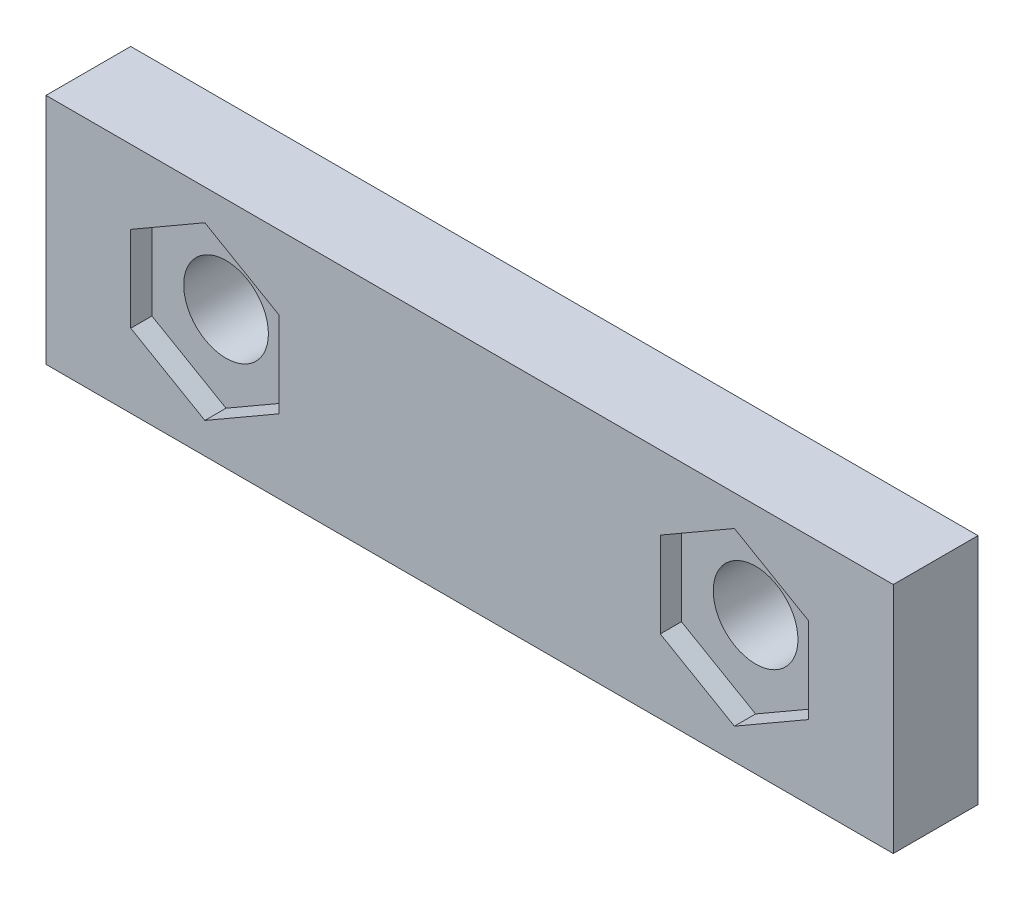
ISO-10303-21;
HEADER;
FILE_DESCRIPTION(('STEP AP214'),'2;1');
FILE_NAME('part.step','',(''),(''),'','','');
FILE_SCHEMA(('AUTOMOTIVE_DESIGN { 1 0 10303 214 1 1 1 1 }'));
ENDSEC;
DATA;
#1=APPLICATION_CONTEXT('core data for automotive mechanical design processes');
#2=APPLICATION_PROTOCOL_DEFINITION('international standard','automotive_design',2000,#1);
#3=PRODUCT_CONTEXT('',#1,'mechanical');
#4=PRODUCT('Part','Part','',(#3));
#5=PRODUCT_RELATED_PRODUCT_CATEGORY('part','',(#4));
#6=PRODUCT_DEFINITION_FORMATION('','',#4);
#7=PRODUCT_DEFINITION_CONTEXT('part definition',#1,'design');
#8=PRODUCT_DEFINITION('design','',#6,#7);
#9=PRODUCT_DEFINITION_SHAPE('','',#8);
#10=(LENGTH_UNIT() NAMED_UNIT(*) SI_UNIT(.MILLI.,.METRE.));
#11=(NAMED_UNIT(*) PLANE_ANGLE_UNIT() SI_UNIT($,.RADIAN.));
#12=(NAMED_UNIT(*) SI_UNIT($,.STERADIAN.) SOLID_ANGLE_UNIT());
#13=UNCERTAINTY_MEASURE_WITH_UNIT(LENGTH_MEASURE(1.E-05),#10,'distance_accuracy_value','');
#14=(GEOMETRIC_REPRESENTATION_CONTEXT(3) GLOBAL_UNCERTAINTY_ASSIGNED_CONTEXT((#13)) GLOBAL_UNIT_ASSIGNED_CONTEXT((#10,
#11,#12)) REPRESENTATION_CONTEXT('',''));
#15=CARTESIAN_POINT('',(0.,0.,0.));
#16=DIRECTION('',(0.,0.,1.));
#17=DIRECTION('',(1.,0.,0.));
#18=AXIS2_PLACEMENT_3D('',#15,#16,#17);
#19=CARTESIAN_POINT('',(0.,0.,3.));
#20=DIRECTION('',(0.,0.,1.));
#21=DIRECTION('',(1.,0.,0.));
#22=AXIS2_PLACEMENT_3D('',#19,#20,#21);
#23=PLANE('',#22);
#24=DIRECTION('',(-0.86602540378444,0.499999999999997,0.));
#25=VECTOR('',#24,1.);
#26=CARTESIAN_POINT('',(31.8394284148495,55.147507698472,3.));
#27=LINE('',#26,#25);
#28=CARTESIAN_POINT('',(212.3,-49.0414518843276,3.));
#29=VERTEX_POINT('',#28);
#30=CARTESIAN_POINT('',(208.8,-47.0207259421639,3.));
#31=VERTEX_POINT('',#30);
#32=EDGE_CURVE('E271',#29,#31,#27,.T.);
#33=ORIENTED_EDGE('',*,*,#32,.F.);
#34=DIRECTION('',(-0.866025403784433,-0.500000000000009,0.));
#35=VECTOR('',#34,1.);
#36=CARTESIAN_POINT('',(74.3105715851521,-128.709685524964,3.));
#37=LINE('',#36,#35);
#38=CARTESIAN_POINT('',(215.8,-47.0207259421639,3.));
#39=VERTEX_POINT('',#38);
#40=EDGE_CURVE('E248',#39,#29,#37,.T.);
#41=ORIENTED_EDGE('',*,*,#40,.F.);
#42=DIRECTION('',(0.,-1.,0.));
#43=VECTOR('',#42,1.);
#44=CARTESIAN_POINT('',(215.8,-1.48205481329132E-12,3.));
#45=LINE('',#44,#43);
#46=CARTESIAN_POINT('',(215.8,-42.9792740578364,3.));
#47=VERTEX_POINT('',#46);
#48=EDGE_CURVE('E263',#47,#39,#45,.T.);
#49=ORIENTED_EDGE('',*,*,#48,.F.);
#50=DIRECTION('',(0.86602540378444,-0.499999999999998,0.));
#51=VECTOR('',#50,1.);
#52=CARTESIAN_POINT('',(35.3394284148497,61.2096855249632,3.));
#53=LINE('',#52,#51);
#54=CARTESIAN_POINT('',(212.3,-40.9585481156727,3.));
#55=VERTEX_POINT('',#54);
#56=EDGE_CURVE('E266',#55,#47,#53,.T.);
#57=ORIENTED_EDGE('',*,*,#56,.F.);
#58=DIRECTION('',(0.866025403784439,0.5,0.));
#59=VECTOR('',#58,1.);
#60=CARTESIAN_POINT('',(70.8105715851499,-122.647507698473,3.));
#61=LINE('',#60,#59);
#62=CARTESIAN_POINT('',(208.8,-42.9792740578364,3.));
#63=VERTEX_POINT('',#62);
#64=EDGE_CURVE('E57',#63,#55,#61,.T.);
#65=ORIENTED_EDGE('',*,*,#64,.F.);
#66=DIRECTION('',(0.,1.,0.));
#67=VECTOR('',#66,1.);
#68=CARTESIAN_POINT('',(208.8,0.,3.));
#69=LINE('',#68,#67);
#70=EDGE_CURVE('E52',#31,#63,#69,.T.);
#71=ORIENTED_EDGE('',*,*,#70,.F.);
#72=EDGE_LOOP('',(#33,#41,#49,#57,#65,#71));
#73=FACE_BOUND('',#72,.T.);
#74=CARTESIAN_POINT('',(212.3,-45.0000000000001,3.));
#75=DIRECTION('',(0.,0.,1.));
#76=DIRECTION('',(1.,0.,0.));
#77=AXIS2_PLACEMENT_3D('',#74,#75,#76);
#78=CIRCLE('',#77,2.);
#79=CARTESIAN_POINT('',(214.3,-45.0000000000001,3.));
#80=VERTEX_POINT('',#79);
#81=EDGE_CURVE('E274',#80,#80,#78,.T.);
#82=ORIENTED_EDGE('',*,*,#81,.F.);
#83=EDGE_LOOP('',(#82));
#84=FACE_BOUND('',#83,.T.);
#85=ADVANCED_FACE('F37',(#73,#84),#23,.T.);
#86=CARTESIAN_POINT('',(0.,-39.5000000000002,3.));
#87=DIRECTION('',(0.,-1.,0.));
#88=DIRECTION('',(1.,0.,0.));
#89=AXIS2_PLACEMENT_3D('',#86,#87,#88);
#90=PLANE('',#89);
#91=DIRECTION('',(-1.,0.,0.));
#92=VECTOR('',#91,1.);
#93=CARTESIAN_POINT('',(0.,-39.5000000000002,0.));
#94=LINE('',#93,#92);
#95=CARTESIAN_POINT('',(219.8,-39.5000000000001,0.));
#96=VERTEX_POINT('',#95);
#97=CARTESIAN_POINT('',(179.8,-39.5000000000002,0.));
#98=VERTEX_POINT('',#97);
#99=EDGE_CURVE('E273',#96,#98,#94,.T.);
#100=ORIENTED_EDGE('',*,*,#99,.T.);
#101=DIRECTION('',(0.,0.,-1.));
#102=VECTOR('',#101,1.);
#103=CARTESIAN_POINT('',(179.8,-39.5000000000002,3.));
#104=LINE('',#103,#102);
#105=CARTESIAN_POINT('',(179.8,-39.5000000000002,4.));
#106=VERTEX_POINT('',#105);
#107=EDGE_CURVE('E11',#106,#98,#104,.T.);
#108=ORIENTED_EDGE('',*,*,#107,.F.);
#109=DIRECTION('',(-1.,0.,0.));
#110=VECTOR('',#109,1.);
#111=CARTESIAN_POINT('',(0.,-39.5000000000002,4.));
#112=LINE('',#111,#110);
#113=CARTESIAN_POINT('',(219.8,-39.5000000000001,4.));
#114=VERTEX_POINT('',#113);
#115=EDGE_CURVE('E204',#114,#106,#112,.T.);
#116=ORIENTED_EDGE('',*,*,#115,.F.);
#117=DIRECTION('',(0.,0.,-1.));
#118=VECTOR('',#117,1.);
#119=CARTESIAN_POINT('',(219.8,-39.5000000000001,3.));
#120=LINE('',#119,#118);
#121=EDGE_CURVE('E281',#114,#96,#120,.T.);
#122=ORIENTED_EDGE('',*,*,#121,.T.);
#123=EDGE_LOOP('',(#100,#108,#116,#122));
#124=FACE_BOUND('',#123,.T.);
#125=ADVANCED_FACE('F39',(#124),#90,.F.);
#126=CARTESIAN_POINT('',(179.8,0.,3.));
#127=DIRECTION('',(1.,0.,0.));
#128=DIRECTION('',(0.,0.,-1.));
#129=AXIS2_PLACEMENT_3D('',#126,#127,#128);
#130=PLANE('',#129);
#131=DIRECTION('',(0.,-1.,0.));
#132=VECTOR('',#131,1.);
#133=CARTESIAN_POINT('',(179.8,0.,0.));
#134=LINE('',#133,#132);
#135=CARTESIAN_POINT('',(179.8,-50.5000000000001,0.));
#136=VERTEX_POINT('',#135);
#137=EDGE_CURVE('E284',#98,#136,#134,.T.);
#138=ORIENTED_EDGE('',*,*,#137,.T.);
#139=DIRECTION('',(0.,0.,-1.));
#140=VECTOR('',#139,1.);
#141=CARTESIAN_POINT('',(179.8,-50.5000000000001,3.));
#142=LINE('',#141,#140);
#143=CARTESIAN_POINT('',(179.8,-50.5000000000001,4.));
#144=VERTEX_POINT('',#143);
#145=EDGE_CURVE('E45',#144,#136,#142,.T.);
#146=ORIENTED_EDGE('',*,*,#145,.F.);
#147=DIRECTION('',(0.,-1.,0.));
#148=VECTOR('',#147,1.);
#149=CARTESIAN_POINT('',(179.8,0.,4.));
#150=LINE('',#149,#148);
#151=EDGE_CURVE('E207',#106,#144,#150,.T.);
#152=ORIENTED_EDGE('',*,*,#151,.F.);
#153=ORIENTED_EDGE('',*,*,#107,.T.);
#154=EDGE_LOOP('',(#138,#146,#152,#153));
#155=FACE_BOUND('',#154,.T.);
#156=ADVANCED_FACE('F306',(#155),#130,.F.);
#157=CARTESIAN_POINT('',(0.,-50.5000000000002,3.));
#158=DIRECTION('',(0.,-1.,0.));
#159=DIRECTION('',(1.,0.,0.));
#160=AXIS2_PLACEMENT_3D('',#157,#158,#159);
#161=PLANE('',#160);
#162=DIRECTION('',(-1.,0.,0.));
#163=VECTOR('',#162,1.);
#164=CARTESIAN_POINT('',(0.,-50.5000000000002,0.));
#165=LINE('',#164,#163);
#166=CARTESIAN_POINT('',(219.8,-50.5000000000001,0.));
#167=VERTEX_POINT('',#166);
#168=EDGE_CURVE('E287',#167,#136,#165,.T.);
#169=ORIENTED_EDGE('',*,*,#168,.F.);
#170=DIRECTION('',(0.,0.,-1.));
#171=VECTOR('',#170,1.);
#172=CARTESIAN_POINT('',(219.8,-50.5000000000001,3.));
#173=LINE('',#172,#171);
#174=CARTESIAN_POINT('',(219.8,-50.5000000000001,4.));
#175=VERTEX_POINT('',#174);
#176=EDGE_CURVE('E299',#175,#167,#173,.T.);
#177=ORIENTED_EDGE('',*,*,#176,.F.);
#178=DIRECTION('',(-1.,0.,0.));
#179=VECTOR('',#178,1.);
#180=CARTESIAN_POINT('',(0.,-50.5000000000002,4.));
#181=LINE('',#180,#179);
#182=EDGE_CURVE('E210',#175,#144,#181,.T.);
#183=ORIENTED_EDGE('',*,*,#182,.T.);
#184=ORIENTED_EDGE('',*,*,#145,.T.);
#185=EDGE_LOOP('',(#169,#177,#183,#184));
#186=FACE_BOUND('',#185,.T.);
#187=ADVANCED_FACE('F302',(#186),#161,.T.);
#188=CARTESIAN_POINT('',(212.3,-45.0000000000001,3.));
#189=DIRECTION('',(0.,0.,-1.));
#190=DIRECTION('',(-1.,0.,0.));
#191=AXIS2_PLACEMENT_3D('',#188,#189,#190);
#192=CYLINDRICAL_SURFACE('',#191,2.);
#193=ORIENTED_EDGE('',*,*,#81,.T.);
#194=EDGE_LOOP('',(#193));
#195=FACE_BOUND('',#194,.T.);
#196=CARTESIAN_POINT('',(212.3,-45.0000000000001,0.));
#197=DIRECTION('',(0.,0.,1.));
#198=DIRECTION('',(1.,0.,0.));
#199=AXIS2_PLACEMENT_3D('',#196,#197,#198);
#200=CIRCLE('',#199,2.);
#201=CARTESIAN_POINT('',(214.3,-45.0000000000001,0.));
#202=VERTEX_POINT('',#201);
#203=EDGE_CURVE('E293',#202,#202,#200,.T.);
#204=ORIENTED_EDGE('',*,*,#203,.F.);
#205=EDGE_LOOP('',(#204));
#206=FACE_BOUND('',#205,.T.);
#207=ADVANCED_FACE('F491',(#195,#206),#192,.F.);
#208=CARTESIAN_POINT('',(219.8,0.,3.));
#209=DIRECTION('',(1.,0.,0.));
#210=DIRECTION('',(0.,0.,-1.));
#211=AXIS2_PLACEMENT_3D('',#208,#209,#210);
#212=PLANE('',#211);
#213=DIRECTION('',(0.,-1.,0.));
#214=VECTOR('',#213,1.);
#215=CARTESIAN_POINT('',(219.8,0.,0.));
#216=LINE('',#215,#214);
#217=EDGE_CURVE('E290',#96,#167,#216,.T.);
#218=ORIENTED_EDGE('',*,*,#217,.F.);
#219=ORIENTED_EDGE('',*,*,#121,.F.);
#220=DIRECTION('',(0.,-1.,0.));
#221=VECTOR('',#220,1.);
#222=CARTESIAN_POINT('',(219.8,0.,4.));
#223=LINE('',#222,#221);
#224=EDGE_CURVE('E213',#114,#175,#223,.T.);
#225=ORIENTED_EDGE('',*,*,#224,.T.);
#226=ORIENTED_EDGE('',*,*,#176,.T.);
#227=EDGE_LOOP('',(#218,#219,#225,#226));
#228=FACE_BOUND('',#227,.T.);
#229=ADVANCED_FACE('F313',(#228),#212,.T.);
#230=CARTESIAN_POINT('',(187.3,-45.0000000000001,3.));
#231=DIRECTION('',(0.,0.,-1.));
#232=DIRECTION('',(-1.,0.,0.));
#233=AXIS2_PLACEMENT_3D('',#230,#231,#232);
#234=CYLINDRICAL_SURFACE('',#233,2.);
#235=CARTESIAN_POINT('',(187.3,-45.0000000000001,3.));
#236=DIRECTION('',(0.,0.,1.));
#237=DIRECTION('',(1.,0.,0.));
#238=AXIS2_PLACEMENT_3D('',#235,#236,#237);
#239=CIRCLE('',#238,2.);
#240=CARTESIAN_POINT('',(189.3,-45.0000000000001,3.));
#241=VERTEX_POINT('',#240);
#242=EDGE_CURVE('E277',#241,#241,#239,.T.);
#243=ORIENTED_EDGE('',*,*,#242,.T.);
#244=EDGE_LOOP('',(#243));
#245=FACE_BOUND('',#244,.T.);
#246=CARTESIAN_POINT('',(187.3,-45.0000000000001,0.));
#247=DIRECTION('',(0.,0.,1.));
#248=DIRECTION('',(1.,0.,0.));
#249=AXIS2_PLACEMENT_3D('',#246,#247,#248);
#250=CIRCLE('',#249,2.);
#251=CARTESIAN_POINT('',(189.3,-45.0000000000001,0.));
#252=VERTEX_POINT('',#251);
#253=EDGE_CURVE('E278',#252,#252,#250,.T.);
#254=ORIENTED_EDGE('',*,*,#253,.F.);
#255=EDGE_LOOP('',(#254));
#256=FACE_BOUND('',#255,.T.);
#257=ADVANCED_FACE('F331',(#245,#256),#234,.F.);
#258=DIRECTION('',(-0.866025403784439,0.5,0.));
#259=VECTOR('',#258,1.);
#260=CARTESIAN_POINT('',(25.5894284148501,44.322190151167,3.));
#261=LINE('',#260,#259);
#262=CARTESIAN_POINT('',(187.3,-49.0414518843276,3.));
#263=VERTEX_POINT('',#262);
#264=CARTESIAN_POINT('',(183.8,-47.0207259421638,3.));
#265=VERTEX_POINT('',#264);
#266=EDGE_CURVE('E155',#263,#265,#261,.T.);
#267=ORIENTED_EDGE('',*,*,#266,.F.);
#268=DIRECTION('',(-0.866025403784439,-0.5,0.));
#269=VECTOR('',#268,1.);
#270=CARTESIAN_POINT('',(68.06057158515,-117.884367977658,3.));
#271=LINE('',#270,#269);
#272=CARTESIAN_POINT('',(190.8,-47.0207259421638,3.));
#273=VERTEX_POINT('',#272);
#274=EDGE_CURVE('E234',#273,#263,#271,.T.);
#275=ORIENTED_EDGE('',*,*,#274,.F.);
#276=DIRECTION('',(0.,-1.,0.));
#277=VECTOR('',#276,1.);
#278=CARTESIAN_POINT('',(190.799999999999,2.6207234325856E-12,3.));
#279=LINE('',#278,#277);
#280=CARTESIAN_POINT('',(190.8,-42.9792740578365,3.));
#281=VERTEX_POINT('',#280);
#282=EDGE_CURVE('E251',#281,#273,#279,.T.);
#283=ORIENTED_EDGE('',*,*,#282,.F.);
#284=DIRECTION('',(0.866025403784438,-0.500000000000001,0.));
#285=VECTOR('',#284,1.);
#286=CARTESIAN_POINT('',(29.0894284148502,50.3843679776582,3.));
#287=LINE('',#286,#285);
#288=CARTESIAN_POINT('',(187.3,-40.9585481156728,3.));
#289=VERTEX_POINT('',#288);
#290=EDGE_CURVE('E254',#289,#281,#287,.T.);
#291=ORIENTED_EDGE('',*,*,#290,.F.);
#292=DIRECTION('',(0.866025403784439,0.5,0.));
#293=VECTOR('',#292,1.);
#294=CARTESIAN_POINT('',(64.56057158515,-111.822190151167,3.));
#295=LINE('',#294,#293);
#296=CARTESIAN_POINT('',(183.8,-42.9792740578365,3.));
#297=VERTEX_POINT('',#296);
#298=EDGE_CURVE('E257',#297,#289,#295,.T.);
#299=ORIENTED_EDGE('',*,*,#298,.F.);
#300=DIRECTION('',(0.,1.,0.));
#301=VECTOR('',#300,1.);
#302=CARTESIAN_POINT('',(183.8,0.,3.));
#303=LINE('',#302,#301);
#304=EDGE_CURVE('E260',#265,#297,#303,.T.);
#305=ORIENTED_EDGE('',*,*,#304,.F.);
#306=EDGE_LOOP('',(#267,#275,#283,#291,#299,#305));
#307=FACE_BOUND('',#306,.T.);
#308=ORIENTED_EDGE('',*,*,#242,.F.);
#309=EDGE_LOOP('',(#308));
#310=FACE_BOUND('',#309,.T.);
#311=ADVANCED_FACE('F324',(#307,#310),#23,.T.);
#312=CARTESIAN_POINT('',(0.,0.,0.));
#313=DIRECTION('',(0.,0.,1.));
#314=DIRECTION('',(1.,0.,0.));
#315=AXIS2_PLACEMENT_3D('',#312,#313,#314);
#316=PLANE('',#315);
#317=ORIENTED_EDGE('',*,*,#253,.T.);
#318=EDGE_LOOP('',(#317));
#319=FACE_BOUND('',#318,.T.);
#320=ORIENTED_EDGE('',*,*,#99,.F.);
#321=ORIENTED_EDGE('',*,*,#217,.T.);
#322=ORIENTED_EDGE('',*,*,#168,.T.);
#323=ORIENTED_EDGE('',*,*,#137,.F.);
#324=EDGE_LOOP('',(#320,#321,#322,#323));
#325=FACE_BOUND('',#324,.T.);
#326=ORIENTED_EDGE('',*,*,#203,.T.);
#327=EDGE_LOOP('',(#326));
#328=FACE_BOUND('',#327,.T.);
#329=ADVANCED_FACE('F309',(#319,#325,#328),#316,.F.);
#330=CARTESIAN_POINT('',(31.8394284148495,55.147507698472,4.));
#331=DIRECTION('',(0.499999999999997,0.86602540378444,0.));
#332=DIRECTION('',(-0.86602540378444,0.499999999999997,0.));
#333=AXIS2_PLACEMENT_3D('',#330,#331,#332);
#334=PLANE('',#333);
#335=DIRECTION('',(0.,0.,-1.));
#336=VECTOR('',#335,1.);
#337=CARTESIAN_POINT('',(212.3,-49.0414518843276,4.));
#338=LINE('',#337,#336);
#339=CARTESIAN_POINT('',(212.3,-49.0414518843276,4.));
#340=VERTEX_POINT('',#339);
#341=EDGE_CURVE('E159',#340,#29,#338,.T.);
#342=ORIENTED_EDGE('',*,*,#341,.T.);
#343=ORIENTED_EDGE('',*,*,#32,.T.);
#344=DIRECTION('',(0.,0.,-1.));
#345=VECTOR('',#344,1.);
#346=CARTESIAN_POINT('',(208.8,-47.0207259421639,4.));
#347=LINE('',#346,#345);
#348=CARTESIAN_POINT('',(208.8,-47.0207259421639,4.));
#349=VERTEX_POINT('',#348);
#350=EDGE_CURVE('E231',#349,#31,#347,.T.);
#351=ORIENTED_EDGE('',*,*,#350,.F.);
#352=DIRECTION('',(0.86602540378444,-0.499999999999997,0.));
#353=VECTOR('',#352,1.);
#354=CARTESIAN_POINT('',(31.8394284148495,55.147507698472,4.));
#355=LINE('',#354,#353);
#356=EDGE_CURVE('E186',#349,#340,#355,.T.);
#357=ORIENTED_EDGE('',*,*,#356,.T.);
#358=EDGE_LOOP('',(#342,#343,#351,#357));
#359=FACE_BOUND('',#358,.T.);
#360=ADVANCED_FACE('F337',(#359),#334,.T.);
#361=CARTESIAN_POINT('',(208.8,0.,4.));
#362=DIRECTION('',(1.,0.,0.));
#363=DIRECTION('',(0.,0.,-1.));
#364=AXIS2_PLACEMENT_3D('',#361,#362,#363);
#365=PLANE('',#364);
#366=ORIENTED_EDGE('',*,*,#350,.T.);
#367=ORIENTED_EDGE('',*,*,#70,.T.);
#368=DIRECTION('',(0.,0.,-1.));
#369=VECTOR('',#368,1.);
#370=CARTESIAN_POINT('',(208.8,-42.9792740578364,4.));
#371=LINE('',#370,#369);
#372=CARTESIAN_POINT('',(208.8,-42.9792740578364,4.));
#373=VERTEX_POINT('',#372);
#374=EDGE_CURVE('E228',#373,#63,#371,.T.);
#375=ORIENTED_EDGE('',*,*,#374,.F.);
#376=DIRECTION('',(0.,-1.,0.));
#377=VECTOR('',#376,1.);
#378=CARTESIAN_POINT('',(208.8,0.,4.));
#379=LINE('',#378,#377);
#380=EDGE_CURVE('E189',#373,#349,#379,.T.);
#381=ORIENTED_EDGE('',*,*,#380,.T.);
#382=EDGE_LOOP('',(#366,#367,#375,#381));
#383=FACE_BOUND('',#382,.T.);
#384=ADVANCED_FACE('F383',(#383),#365,.T.);
#385=CARTESIAN_POINT('',(70.8105715851499,-122.647507698473,4.));
#386=DIRECTION('',(0.5,-0.866025403784438,0.));
#387=DIRECTION('',(0.866025403784439,0.5,0.));
#388=AXIS2_PLACEMENT_3D('',#385,#386,#387);
#389=PLANE('',#388);
#390=ORIENTED_EDGE('',*,*,#374,.T.);
#391=ORIENTED_EDGE('',*,*,#64,.T.);
#392=DIRECTION('',(0.,0.,-1.));
#393=VECTOR('',#392,1.);
#394=CARTESIAN_POINT('',(212.3,-40.9585481156728,4.));
#395=LINE('',#394,#393);
#396=CARTESIAN_POINT('',(212.3,-40.9585481156728,4.));
#397=VERTEX_POINT('',#396);
#398=EDGE_CURVE('E225',#397,#55,#395,.T.);
#399=ORIENTED_EDGE('',*,*,#398,.F.);
#400=DIRECTION('',(-0.866025403784439,-0.5,0.));
#401=VECTOR('',#400,1.);
#402=CARTESIAN_POINT('',(70.8105715851499,-122.647507698473,4.));
#403=LINE('',#402,#401);
#404=EDGE_CURVE('E192',#397,#373,#403,.T.);
#405=ORIENTED_EDGE('',*,*,#404,.T.);
#406=EDGE_LOOP('',(#390,#391,#399,#405));
#407=FACE_BOUND('',#406,.T.);
#408=ADVANCED_FACE('F374',(#407),#389,.T.);
#409=CARTESIAN_POINT('',(35.3394284148497,61.2096855249632,4.));
#410=DIRECTION('',(-0.499999999999998,-0.86602540378444,0.));
#411=DIRECTION('',(0.86602540378444,-0.499999999999998,0.));
#412=AXIS2_PLACEMENT_3D('',#409,#410,#411);
#413=PLANE('',#412);
#414=ORIENTED_EDGE('',*,*,#398,.T.);
#415=ORIENTED_EDGE('',*,*,#56,.T.);
#416=DIRECTION('',(0.,0.,-1.));
#417=VECTOR('',#416,1.);
#418=CARTESIAN_POINT('',(215.8,-42.9792740578364,4.));
#419=LINE('',#418,#417);
#420=CARTESIAN_POINT('',(215.8,-42.9792740578364,4.));
#421=VERTEX_POINT('',#420);
#422=EDGE_CURVE('E222',#421,#47,#419,.T.);
#423=ORIENTED_EDGE('',*,*,#422,.F.);
#424=DIRECTION('',(-0.86602540378444,0.499999999999998,0.));
#425=VECTOR('',#424,1.);
#426=CARTESIAN_POINT('',(35.3394284148497,61.2096855249632,4.));
#427=LINE('',#426,#425);
#428=EDGE_CURVE('E195',#421,#397,#427,.T.);
#429=ORIENTED_EDGE('',*,*,#428,.T.);
#430=EDGE_LOOP('',(#414,#415,#423,#429));
#431=FACE_BOUND('',#430,.T.);
#432=ADVANCED_FACE('F368',(#431),#413,.T.);
#433=CARTESIAN_POINT('',(215.8,-1.48205481329132E-12,4.));
#434=DIRECTION('',(-1.,0.,0.));
#435=DIRECTION('',(0.,-1.,0.));
#436=AXIS2_PLACEMENT_3D('',#433,#434,#435);
#437=PLANE('',#436);
#438=ORIENTED_EDGE('',*,*,#422,.T.);
#439=ORIENTED_EDGE('',*,*,#48,.T.);
#440=DIRECTION('',(0.,0.,-1.));
#441=VECTOR('',#440,1.);
#442=CARTESIAN_POINT('',(215.8,-47.0207259421639,4.));
#443=LINE('',#442,#441);
#444=CARTESIAN_POINT('',(215.8,-47.0207259421639,4.));
#445=VERTEX_POINT('',#444);
#446=EDGE_CURVE('E219',#445,#39,#443,.T.);
#447=ORIENTED_EDGE('',*,*,#446,.F.);
#448=DIRECTION('',(0.,1.,0.));
#449=VECTOR('',#448,1.);
#450=CARTESIAN_POINT('',(215.8,-1.48205481329132E-12,4.));
#451=LINE('',#450,#449);
#452=EDGE_CURVE('E198',#445,#421,#451,.T.);
#453=ORIENTED_EDGE('',*,*,#452,.T.);
#454=EDGE_LOOP('',(#438,#439,#447,#453));
#455=FACE_BOUND('',#454,.T.);
#456=ADVANCED_FACE('F364',(#455),#437,.T.);
#457=CARTESIAN_POINT('',(25.5894284148501,44.322190151167,4.));
#458=DIRECTION('',(0.5,0.866025403784438,0.));
#459=DIRECTION('',(-0.866025403784439,0.5,0.));
#460=AXIS2_PLACEMENT_3D('',#457,#458,#459);
#461=PLANE('',#460);
#462=DIRECTION('',(0.,0.,-1.));
#463=VECTOR('',#462,1.);
#464=CARTESIAN_POINT('',(187.3,-49.0414518843276,4.));
#465=LINE('',#464,#463);
#466=CARTESIAN_POINT('',(187.3,-49.0414518843276,4.));
#467=VERTEX_POINT('',#466);
#468=EDGE_CURVE('E216',#467,#263,#465,.T.);
#469=ORIENTED_EDGE('',*,*,#468,.T.);
#470=ORIENTED_EDGE('',*,*,#266,.T.);
#471=DIRECTION('',(0.,0.,-1.));
#472=VECTOR('',#471,1.);
#473=CARTESIAN_POINT('',(183.8,-47.0207259421638,4.));
#474=LINE('',#473,#472);
#475=CARTESIAN_POINT('',(183.8,-47.0207259421638,4.));
#476=VERTEX_POINT('',#475);
#477=EDGE_CURVE('E149',#476,#265,#474,.T.);
#478=ORIENTED_EDGE('',*,*,#477,.F.);
#479=DIRECTION('',(0.866025403784439,-0.5,0.));
#480=VECTOR('',#479,1.);
#481=CARTESIAN_POINT('',(25.5894284148501,44.322190151167,4.));
#482=LINE('',#481,#480);
#483=EDGE_CURVE('E153',#476,#467,#482,.T.);
#484=ORIENTED_EDGE('',*,*,#483,.T.);
#485=EDGE_LOOP('',(#469,#470,#478,#484));
#486=FACE_BOUND('',#485,.T.);
#487=ADVANCED_FACE('F152',(#486),#461,.T.);
#488=CARTESIAN_POINT('',(183.8,0.,4.));
#489=DIRECTION('',(1.,0.,0.));
#490=DIRECTION('',(0.,0.,-1.));
#491=AXIS2_PLACEMENT_3D('',#488,#489,#490);
#492=PLANE('',#491);
#493=ORIENTED_EDGE('',*,*,#477,.T.);
#494=ORIENTED_EDGE('',*,*,#304,.T.);
#495=DIRECTION('',(0.,0.,-1.));
#496=VECTOR('',#495,1.);
#497=CARTESIAN_POINT('',(183.8,-42.9792740578365,4.));
#498=LINE('',#497,#496);
#499=CARTESIAN_POINT('',(183.8,-42.9792740578365,4.));
#500=VERTEX_POINT('',#499);
#501=EDGE_CURVE('E160',#500,#297,#498,.T.);
#502=ORIENTED_EDGE('',*,*,#501,.F.);
#503=DIRECTION('',(0.,-1.,0.));
#504=VECTOR('',#503,1.);
#505=CARTESIAN_POINT('',(183.8,0.,4.));
#506=LINE('',#505,#504);
#507=EDGE_CURVE('E167',#500,#476,#506,.T.);
#508=ORIENTED_EDGE('',*,*,#507,.T.);
#509=EDGE_LOOP('',(#493,#494,#502,#508));
#510=FACE_BOUND('',#509,.T.);
#511=ADVANCED_FACE('F173',(#510),#492,.T.);
#512=CARTESIAN_POINT('',(64.56057158515,-111.822190151167,4.));
#513=DIRECTION('',(0.5,-0.866025403784438,0.));
#514=DIRECTION('',(0.866025403784439,0.5,0.));
#515=AXIS2_PLACEMENT_3D('',#512,#513,#514);
#516=PLANE('',#515);
#517=ORIENTED_EDGE('',*,*,#501,.T.);
#518=ORIENTED_EDGE('',*,*,#298,.T.);
#519=DIRECTION('',(0.,0.,-1.));
#520=VECTOR('',#519,1.);
#521=CARTESIAN_POINT('',(187.3,-40.9585481156728,4.));
#522=LINE('',#521,#520);
#523=CARTESIAN_POINT('',(187.3,-40.9585481156728,4.));
#524=VERTEX_POINT('',#523);
#525=EDGE_CURVE('E242',#524,#289,#522,.T.);
#526=ORIENTED_EDGE('',*,*,#525,.F.);
#527=DIRECTION('',(-0.866025403784439,-0.5,0.));
#528=VECTOR('',#527,1.);
#529=CARTESIAN_POINT('',(64.56057158515,-111.822190151167,4.));
#530=LINE('',#529,#528);
#531=EDGE_CURVE('E175',#524,#500,#530,.T.);
#532=ORIENTED_EDGE('',*,*,#531,.T.);
#533=EDGE_LOOP('',(#517,#518,#526,#532));
#534=FACE_BOUND('',#533,.T.);
#535=ADVANCED_FACE('F353',(#534),#516,.T.);
#536=CARTESIAN_POINT('',(29.0894284148502,50.3843679776582,4.));
#537=DIRECTION('',(-0.500000000000001,-0.866025403784438,0.));
#538=DIRECTION('',(0.866025403784438,-0.500000000000001,0.));
#539=AXIS2_PLACEMENT_3D('',#536,#537,#538);
#540=PLANE('',#539);
#541=ORIENTED_EDGE('',*,*,#525,.T.);
#542=ORIENTED_EDGE('',*,*,#290,.T.);
#543=DIRECTION('',(0.,0.,-1.));
#544=VECTOR('',#543,1.);
#545=CARTESIAN_POINT('',(190.8,-42.9792740578365,4.));
#546=LINE('',#545,#544);
#547=CARTESIAN_POINT('',(190.8,-42.9792740578365,4.));
#548=VERTEX_POINT('',#547);
#549=EDGE_CURVE('E239',#548,#281,#546,.T.);
#550=ORIENTED_EDGE('',*,*,#549,.F.);
#551=DIRECTION('',(-0.866025403784438,0.500000000000001,0.));
#552=VECTOR('',#551,1.);
#553=CARTESIAN_POINT('',(29.0894284148502,50.3843679776582,4.));
#554=LINE('',#553,#552);
#555=EDGE_CURVE('E177',#548,#524,#554,.T.);
#556=ORIENTED_EDGE('',*,*,#555,.T.);
#557=EDGE_LOOP('',(#541,#542,#550,#556));
#558=FACE_BOUND('',#557,.T.);
#559=ADVANCED_FACE('F351',(#558),#540,.T.);
#560=CARTESIAN_POINT('',(190.799999999999,2.6207234325856E-12,4.));
#561=DIRECTION('',(-1.,0.,0.));
#562=DIRECTION('',(0.,-1.,0.));
#563=AXIS2_PLACEMENT_3D('',#560,#561,#562);
#564=PLANE('',#563);
#565=ORIENTED_EDGE('',*,*,#549,.T.);
#566=ORIENTED_EDGE('',*,*,#282,.T.);
#567=DIRECTION('',(0.,0.,-1.));
#568=VECTOR('',#567,1.);
#569=CARTESIAN_POINT('',(190.8,-47.0207259421638,4.));
#570=LINE('',#569,#568);
#571=CARTESIAN_POINT('',(190.8,-47.0207259421638,4.));
#572=VERTEX_POINT('',#571);
#573=EDGE_CURVE('E236',#572,#273,#570,.T.);
#574=ORIENTED_EDGE('',*,*,#573,.F.);
#575=DIRECTION('',(0.,1.,0.));
#576=VECTOR('',#575,1.);
#577=CARTESIAN_POINT('',(190.799999999999,2.6207234325856E-12,4.));
#578=LINE('',#577,#576);
#579=EDGE_CURVE('E182',#572,#548,#578,.T.);
#580=ORIENTED_EDGE('',*,*,#579,.T.);
#581=EDGE_LOOP('',(#565,#566,#574,#580));
#582=FACE_BOUND('',#581,.T.);
#583=ADVANCED_FACE('F348',(#582),#564,.T.);
#584=CARTESIAN_POINT('',(74.3105715851521,-128.709685524964,4.));
#585=DIRECTION('',(-0.500000000000009,0.866025403784433,0.));
#586=DIRECTION('',(-0.866025403784433,-0.500000000000009,0.));
#587=AXIS2_PLACEMENT_3D('',#584,#585,#586);
#588=PLANE('',#587);
#589=ORIENTED_EDGE('',*,*,#446,.T.);
#590=ORIENTED_EDGE('',*,*,#40,.T.);
#591=ORIENTED_EDGE('',*,*,#341,.F.);
#592=DIRECTION('',(0.866025403784433,0.500000000000009,0.));
#593=VECTOR('',#592,1.);
#594=CARTESIAN_POINT('',(74.3105715851521,-128.709685524964,4.));
#595=LINE('',#594,#593);
#596=EDGE_CURVE('E201',#340,#445,#595,.T.);
#597=ORIENTED_EDGE('',*,*,#596,.T.);
#598=EDGE_LOOP('',(#589,#590,#591,#597));
#599=FACE_BOUND('',#598,.T.);
#600=ADVANCED_FACE('F378',(#599),#588,.T.);
#601=CARTESIAN_POINT('',(68.06057158515,-117.884367977658,4.));
#602=DIRECTION('',(-0.5,0.866025403784438,0.));
#603=DIRECTION('',(-0.866025403784439,-0.5,0.));
#604=AXIS2_PLACEMENT_3D('',#601,#602,#603);
#605=PLANE('',#604);
#606=ORIENTED_EDGE('',*,*,#573,.T.);
#607=ORIENTED_EDGE('',*,*,#274,.T.);
#608=ORIENTED_EDGE('',*,*,#468,.F.);
#609=DIRECTION('',(0.866025403784439,0.5,0.));
#610=VECTOR('',#609,1.);
#611=CARTESIAN_POINT('',(68.06057158515,-117.884367977658,4.));
#612=LINE('',#611,#610);
#613=EDGE_CURVE('E171',#467,#572,#612,.T.);
#614=ORIENTED_EDGE('',*,*,#613,.T.);
#615=EDGE_LOOP('',(#606,#607,#608,#614));
#616=FACE_BOUND('',#615,.T.);
#617=ADVANCED_FACE('F346',(#616),#605,.T.);
#618=CARTESIAN_POINT('',(0.,0.,4.));
#619=DIRECTION('',(0.,0.,1.));
#620=DIRECTION('',(1.,0.,0.));
#621=AXIS2_PLACEMENT_3D('',#618,#619,#620);
#622=PLANE('',#621);
#623=ORIENTED_EDGE('',*,*,#483,.F.);
#624=ORIENTED_EDGE('',*,*,#507,.F.);
#625=ORIENTED_EDGE('',*,*,#531,.F.);
#626=ORIENTED_EDGE('',*,*,#555,.F.);
#627=ORIENTED_EDGE('',*,*,#579,.F.);
#628=ORIENTED_EDGE('',*,*,#613,.F.);
#629=EDGE_LOOP('',(#623,#624,#625,#626,#627,#628));
#630=FACE_BOUND('',#629,.T.);
#631=ORIENTED_EDGE('',*,*,#356,.F.);
#632=ORIENTED_EDGE('',*,*,#380,.F.);
#633=ORIENTED_EDGE('',*,*,#404,.F.);
#634=ORIENTED_EDGE('',*,*,#428,.F.);
#635=ORIENTED_EDGE('',*,*,#452,.F.);
#636=ORIENTED_EDGE('',*,*,#596,.F.);
#637=EDGE_LOOP('',(#631,#632,#633,#634,#635,#636));
#638=FACE_BOUND('',#637,.T.);
#639=ORIENTED_EDGE('',*,*,#115,.T.);
#640=ORIENTED_EDGE('',*,*,#151,.T.);
#641=ORIENTED_EDGE('',*,*,#182,.F.);
#642=ORIENTED_EDGE('',*,*,#224,.F.);
#643=EDGE_LOOP('',(#639,#640,#641,#642));
#644=FACE_BOUND('',#643,.T.);
#645=ADVANCED_FACE('F164',(#630,#638,#644),#622,.T.);
#646=CLOSED_SHELL('',(#85,#125,#156,#187,#207,#229,#257,#311,#329,#360,#384,#408,#432,#456,#487,
#511,#535,#559,#583,#600,#617,#645));
#647=MANIFOLD_SOLID_BREP('B2',#646);
#648=ADVANCED_BREP_SHAPE_REPRESENTATION('',(#18,#647),#14);
#649=SHAPE_DEFINITION_REPRESENTATION(#9,#648);
ENDSEC;
END-ISO-10303-21;
